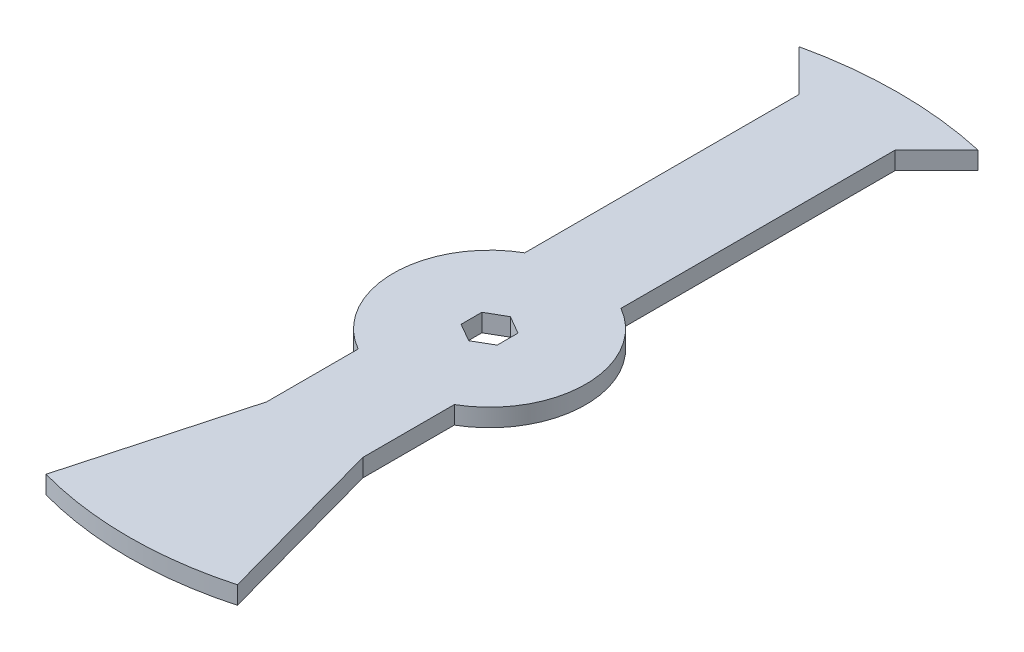
ISO-10303-21;
HEADER;
FILE_DESCRIPTION(('STEP AP214'),'2;1');
FILE_NAME('part.step','',(''),(''),'','','');
FILE_SCHEMA(('AUTOMOTIVE_DESIGN { 1 0 10303 214 1 1 1 1 }'));
ENDSEC;
DATA;
#1=APPLICATION_CONTEXT('core data for automotive mechanical design processes');
#2=APPLICATION_PROTOCOL_DEFINITION('international standard','automotive_design',2000,#1);
#3=PRODUCT_CONTEXT('',#1,'mechanical');
#4=PRODUCT('Part','Part','',(#3));
#5=PRODUCT_RELATED_PRODUCT_CATEGORY('part','',(#4));
#6=PRODUCT_DEFINITION_FORMATION('','',#4);
#7=PRODUCT_DEFINITION_CONTEXT('part definition',#1,'design');
#8=PRODUCT_DEFINITION('design','',#6,#7);
#9=PRODUCT_DEFINITION_SHAPE('','',#8);
#10=(LENGTH_UNIT() NAMED_UNIT(*) SI_UNIT(.MILLI.,.METRE.));
#11=(NAMED_UNIT(*) PLANE_ANGLE_UNIT() SI_UNIT($,.RADIAN.));
#12=(NAMED_UNIT(*) SI_UNIT($,.STERADIAN.) SOLID_ANGLE_UNIT());
#13=UNCERTAINTY_MEASURE_WITH_UNIT(LENGTH_MEASURE(1.E-05),#10,'distance_accuracy_value','');
#14=(GEOMETRIC_REPRESENTATION_CONTEXT(3) GLOBAL_UNCERTAINTY_ASSIGNED_CONTEXT((#13)) GLOBAL_UNIT_ASSIGNED_CONTEXT((#10,
#11,#12)) REPRESENTATION_CONTEXT('',''));
#15=CARTESIAN_POINT('',(0.,0.,0.));
#16=DIRECTION('',(0.,0.,1.));
#17=DIRECTION('',(1.,0.,0.));
#18=AXIS2_PLACEMENT_3D('',#15,#16,#17);
#19=CARTESIAN_POINT('',(-12.7,4.699,0.));
#20=DIRECTION('',(1.,0.,0.));
#21=DIRECTION('',(0.,0.,-1.));
#22=AXIS2_PLACEMENT_3D('',#19,#20,#21);
#23=PLANE('',#22);
#24=DIRECTION('',(0.,0.,1.));
#25=VECTOR('',#24,1.);
#26=CARTESIAN_POINT('',(-12.7,0.,0.));
#27=LINE('',#26,#25);
#28=CARTESIAN_POINT('',(-12.7,0.,21.9970452561247));
#29=VERTEX_POINT('',#28);
#30=CARTESIAN_POINT('',(-12.7,0.,46.1574010426348));
#31=VERTEX_POINT('',#30);
#32=EDGE_CURVE('E177',#29,#31,#27,.T.);
#33=ORIENTED_EDGE('',*,*,#32,.T.);
#34=DIRECTION('',(0.,-1.,0.));
#35=VECTOR('',#34,1.);
#36=CARTESIAN_POINT('',(-12.7,4.699,46.1574010426348));
#37=LINE('',#36,#35);
#38=CARTESIAN_POINT('',(-12.7,4.699,46.1574010426348));
#39=VERTEX_POINT('',#38);
#40=EDGE_CURVE('E12',#39,#31,#37,.T.);
#41=ORIENTED_EDGE('',*,*,#40,.F.);
#42=DIRECTION('',(0.,0.,1.));
#43=VECTOR('',#42,1.);
#44=CARTESIAN_POINT('',(-12.7,4.699,0.));
#45=LINE('',#44,#43);
#46=CARTESIAN_POINT('',(-12.7,4.699,21.9970452561247));
#47=VERTEX_POINT('',#46);
#48=EDGE_CURVE('E217',#47,#39,#45,.T.);
#49=ORIENTED_EDGE('',*,*,#48,.F.);
#50=DIRECTION('',(0.,-1.,0.));
#51=VECTOR('',#50,1.);
#52=CARTESIAN_POINT('',(-12.7,4.699,21.9970452561247));
#53=LINE('',#52,#51);
#54=EDGE_CURVE('E277',#47,#29,#53,.T.);
#55=ORIENTED_EDGE('',*,*,#54,.T.);
#56=EDGE_LOOP('',(#33,#41,#49,#55));
#57=FACE_BOUND('',#56,.T.);
#58=ADVANCED_FACE('F39',(#57),#23,.F.);
#59=CARTESIAN_POINT('',(0.,4.699,0.));
#60=DIRECTION('',(0.964169523899658,0.,0.265286880910283));
#61=DIRECTION('',(0.265286880910283,0.,-0.964169523899658));
#62=AXIS2_PLACEMENT_3D('',#59,#60,#61);
#63=PLANE('',#62);
#64=DIRECTION('',(-0.265286880910283,0.,0.964169523899658));
#65=VECTOR('',#64,1.);
#66=CARTESIAN_POINT('',(0.,0.,0.));
#67=LINE('',#66,#65);
#68=CARTESIAN_POINT('',(-25.2685754067045,0.,91.8371471514424));
#69=VERTEX_POINT('',#68);
#70=EDGE_CURVE('E280',#31,#69,#67,.T.);
#71=ORIENTED_EDGE('',*,*,#70,.T.);
#72=DIRECTION('',(0.,-1.,0.));
#73=VECTOR('',#72,1.);
#74=CARTESIAN_POINT('',(-25.2685754067045,4.699,91.8371471514424));
#75=LINE('',#74,#73);
#76=CARTESIAN_POINT('',(-25.2685754067045,4.699,91.8371471514424));
#77=VERTEX_POINT('',#76);
#78=EDGE_CURVE('E46',#77,#69,#75,.T.);
#79=ORIENTED_EDGE('',*,*,#78,.F.);
#80=DIRECTION('',(-0.265286880910283,0.,0.964169523899658));
#81=VECTOR('',#80,1.);
#82=CARTESIAN_POINT('',(0.,4.699,0.));
#83=LINE('',#82,#81);
#84=EDGE_CURVE('E222',#39,#77,#83,.T.);
#85=ORIENTED_EDGE('',*,*,#84,.F.);
#86=ORIENTED_EDGE('',*,*,#40,.T.);
#87=EDGE_LOOP('',(#71,#79,#85,#86));
#88=FACE_BOUND('',#87,.T.);
#89=ADVANCED_FACE('F384',(#88),#63,.F.);
#90=CARTESIAN_POINT('',(0.,4.699,0.));
#91=DIRECTION('',(0.,-1.,0.));
#92=DIRECTION('',(0.,0.,-1.));
#93=AXIS2_PLACEMENT_3D('',#90,#91,#92);
#94=CYLINDRICAL_SURFACE('',#93,95.25);
#95=CARTESIAN_POINT('',(0.,0.,0.));
#96=DIRECTION('',(0.,1.,0.));
#97=DIRECTION('',(0.,0.,1.));
#98=AXIS2_PLACEMENT_3D('',#95,#96,#97);
#99=CIRCLE('',#98,95.25);
#100=CARTESIAN_POINT('',(25.2685754067045,0.,91.8371471514425));
#101=VERTEX_POINT('',#100);
#102=EDGE_CURVE('E282',#69,#101,#99,.T.);
#103=ORIENTED_EDGE('',*,*,#102,.T.);
#104=DIRECTION('',(0.,-1.,0.));
#105=VECTOR('',#104,1.);
#106=CARTESIAN_POINT('',(25.2685754067045,4.699,91.8371471514425));
#107=LINE('',#106,#105);
#108=CARTESIAN_POINT('',(25.2685754067045,4.699,91.8371471514425));
#109=VERTEX_POINT('',#108);
#110=EDGE_CURVE('E327',#109,#101,#107,.T.);
#111=ORIENTED_EDGE('',*,*,#110,.F.);
#112=CARTESIAN_POINT('',(0.,4.699,0.));
#113=DIRECTION('',(0.,1.,0.));
#114=DIRECTION('',(0.,0.,1.));
#115=AXIS2_PLACEMENT_3D('',#112,#113,#114);
#116=CIRCLE('',#115,95.25);
#117=EDGE_CURVE('E234',#77,#109,#116,.T.);
#118=ORIENTED_EDGE('',*,*,#117,.F.);
#119=ORIENTED_EDGE('',*,*,#78,.T.);
#120=EDGE_LOOP('',(#103,#111,#118,#119));
#121=FACE_BOUND('',#120,.T.);
#122=ADVANCED_FACE('F334',(#121),#94,.T.);
#123=CARTESIAN_POINT('',(0.,4.699,0.));
#124=DIRECTION('',(-0.964169523899658,0.,0.265286880910284));
#125=DIRECTION('',(0.265286880910284,0.,0.964169523899658));
#126=AXIS2_PLACEMENT_3D('',#123,#124,#125);
#127=PLANE('',#126);
#128=DIRECTION('',(-0.265286880910284,0.,-0.964169523899658));
#129=VECTOR('',#128,1.);
#130=CARTESIAN_POINT('',(0.,0.,0.));
#131=LINE('',#130,#129);
#132=CARTESIAN_POINT('',(12.7,0.,46.1574010426348));
#133=VERTEX_POINT('',#132);
#134=EDGE_CURVE('E284',#101,#133,#131,.T.);
#135=ORIENTED_EDGE('',*,*,#134,.T.);
#136=DIRECTION('',(0.,-1.,0.));
#137=VECTOR('',#136,1.);
#138=CARTESIAN_POINT('',(12.7,4.699,46.1574010426348));
#139=LINE('',#138,#137);
#140=CARTESIAN_POINT('',(12.7,4.699,46.1574010426348));
#141=VERTEX_POINT('',#140);
#142=EDGE_CURVE('E325',#141,#133,#139,.T.);
#143=ORIENTED_EDGE('',*,*,#142,.F.);
#144=DIRECTION('',(-0.265286880910284,0.,-0.964169523899658));
#145=VECTOR('',#144,1.);
#146=CARTESIAN_POINT('',(0.,4.699,0.));
#147=LINE('',#146,#145);
#148=EDGE_CURVE('E237',#109,#141,#147,.T.);
#149=ORIENTED_EDGE('',*,*,#148,.F.);
#150=ORIENTED_EDGE('',*,*,#110,.T.);
#151=EDGE_LOOP('',(#135,#143,#149,#150));
#152=FACE_BOUND('',#151,.T.);
#153=ADVANCED_FACE('F342',(#152),#127,.F.);
#154=CARTESIAN_POINT('',(12.7,4.699,0.));
#155=DIRECTION('',(1.,0.,0.));
#156=DIRECTION('',(0.,0.,-1.));
#157=AXIS2_PLACEMENT_3D('',#154,#155,#156);
#158=PLANE('',#157);
#159=DIRECTION('',(0.,0.,1.));
#160=VECTOR('',#159,1.);
#161=CARTESIAN_POINT('',(12.7,0.,0.));
#162=LINE('',#161,#160);
#163=CARTESIAN_POINT('',(12.7,0.,21.9970452561247));
#164=VERTEX_POINT('',#163);
#165=EDGE_CURVE('E287',#164,#133,#162,.T.);
#166=ORIENTED_EDGE('',*,*,#165,.F.);
#167=DIRECTION('',(0.,-1.,0.));
#168=VECTOR('',#167,1.);
#169=CARTESIAN_POINT('',(12.7,4.699,21.9970452561247));
#170=LINE('',#169,#168);
#171=CARTESIAN_POINT('',(12.7,4.699,21.9970452561247));
#172=VERTEX_POINT('',#171);
#173=EDGE_CURVE('E323',#172,#164,#170,.T.);
#174=ORIENTED_EDGE('',*,*,#173,.F.);
#175=DIRECTION('',(0.,0.,1.));
#176=VECTOR('',#175,1.);
#177=CARTESIAN_POINT('',(12.7,4.699,0.));
#178=LINE('',#177,#176);
#179=EDGE_CURVE('E241',#172,#141,#178,.T.);
#180=ORIENTED_EDGE('',*,*,#179,.T.);
#181=ORIENTED_EDGE('',*,*,#142,.T.);
#182=EDGE_LOOP('',(#166,#174,#180,#181));
#183=FACE_BOUND('',#182,.T.);
#184=ADVANCED_FACE('F394',(#183),#158,.T.);
#185=CARTESIAN_POINT('',(0.,4.699,0.));
#186=DIRECTION('',(0.,-1.,0.));
#187=DIRECTION('',(0.,0.,-1.));
#188=AXIS2_PLACEMENT_3D('',#185,#186,#187);
#189=CYLINDRICAL_SURFACE('',#188,25.4);
#190=CARTESIAN_POINT('',(0.,0.,0.));
#191=DIRECTION('',(0.,1.,0.));
#192=DIRECTION('',(0.,0.,1.));
#193=AXIS2_PLACEMENT_3D('',#190,#191,#192);
#194=CIRCLE('',#193,25.4);
#195=CARTESIAN_POINT('',(12.7,0.,-21.9970452561247));
#196=VERTEX_POINT('',#195);
#197=EDGE_CURVE('E290',#196,#164,#194,.F.);
#198=ORIENTED_EDGE('',*,*,#197,.F.);
#199=DIRECTION('',(0.,-1.,0.));
#200=VECTOR('',#199,1.);
#201=CARTESIAN_POINT('',(12.7,4.699,-21.9970452561247));
#202=LINE('',#201,#200);
#203=CARTESIAN_POINT('',(12.7,4.699,-21.9970452561247));
#204=VERTEX_POINT('',#203);
#205=EDGE_CURVE('E321',#204,#196,#202,.T.);
#206=ORIENTED_EDGE('',*,*,#205,.F.);
#207=CARTESIAN_POINT('',(0.,4.699,0.));
#208=DIRECTION('',(0.,1.,0.));
#209=DIRECTION('',(0.,0.,1.));
#210=AXIS2_PLACEMENT_3D('',#207,#208,#209);
#211=CIRCLE('',#210,25.4);
#212=EDGE_CURVE('E246',#204,#172,#211,.F.);
#213=ORIENTED_EDGE('',*,*,#212,.T.);
#214=ORIENTED_EDGE('',*,*,#173,.T.);
#215=EDGE_LOOP('',(#198,#206,#213,#214));
#216=FACE_BOUND('',#215,.T.);
#217=ADVANCED_FACE('F356',(#216),#189,.T.);
#218=CARTESIAN_POINT('',(12.7,4.699,0.));
#219=DIRECTION('',(1.,0.,0.));
#220=DIRECTION('',(0.,0.,-1.));
#221=AXIS2_PLACEMENT_3D('',#218,#219,#220);
#222=PLANE('',#221);
#223=DIRECTION('',(0.,0.,1.));
#224=VECTOR('',#223,1.);
#225=CARTESIAN_POINT('',(12.7,0.,0.));
#226=LINE('',#225,#224);
#227=CARTESIAN_POINT('',(12.7,0.,-94.3995365454725));
#228=VERTEX_POINT('',#227);
#229=EDGE_CURVE('E293',#228,#196,#226,.T.);
#230=ORIENTED_EDGE('',*,*,#229,.F.);
#231=DIRECTION('',(0.,-1.,0.));
#232=VECTOR('',#231,1.);
#233=CARTESIAN_POINT('',(12.7,4.699,-94.3995365454725));
#234=LINE('',#233,#232);
#235=CARTESIAN_POINT('',(12.7,4.699,-94.3995365454725));
#236=VERTEX_POINT('',#235);
#237=EDGE_CURVE('E319',#236,#228,#234,.T.);
#238=ORIENTED_EDGE('',*,*,#237,.F.);
#239=DIRECTION('',(0.,0.,1.));
#240=VECTOR('',#239,1.);
#241=CARTESIAN_POINT('',(12.7,4.699,0.));
#242=LINE('',#241,#240);
#243=EDGE_CURVE('E252',#236,#204,#242,.T.);
#244=ORIENTED_EDGE('',*,*,#243,.T.);
#245=ORIENTED_EDGE('',*,*,#205,.T.);
#246=EDGE_LOOP('',(#230,#238,#244,#245));
#247=FACE_BOUND('',#246,.T.);
#248=ADVANCED_FACE('F361',(#247),#222,.T.);
#249=CARTESIAN_POINT('',(-40.8497682727362,4.699,-40.8497682727361));
#250=DIRECTION('',(0.707106781186548,0.,0.707106781186547));
#251=DIRECTION('',(0.707106781186547,0.,-0.707106781186548));
#252=AXIS2_PLACEMENT_3D('',#249,#250,#251);
#253=PLANE('',#252);
#254=DIRECTION('',(-0.707106781186547,0.,0.707106781186548));
#255=VECTOR('',#254,1.);
#256=CARTESIAN_POINT('',(-40.8497682727362,0.,-40.8497682727361));
#257=LINE('',#256,#255);
#258=CARTESIAN_POINT('',(23.6319941261292,0.,-105.331530671602));
#259=VERTEX_POINT('',#258);
#260=EDGE_CURVE('E296',#259,#228,#257,.T.);
#261=ORIENTED_EDGE('',*,*,#260,.F.);
#262=DIRECTION('',(0.,-1.,0.));
#263=VECTOR('',#262,1.);
#264=CARTESIAN_POINT('',(23.6319941261292,4.699,-105.331530671602));
#265=LINE('',#264,#263);
#266=CARTESIAN_POINT('',(23.6319941261292,4.699,-105.331530671602));
#267=VERTEX_POINT('',#266);
#268=EDGE_CURVE('E317',#267,#259,#265,.T.);
#269=ORIENTED_EDGE('',*,*,#268,.F.);
#270=DIRECTION('',(-0.707106781186547,0.,0.707106781186548));
#271=VECTOR('',#270,1.);
#272=CARTESIAN_POINT('',(-40.8497682727362,4.699,-40.8497682727361));
#273=LINE('',#272,#271);
#274=EDGE_CURVE('E256',#267,#236,#273,.T.);
#275=ORIENTED_EDGE('',*,*,#274,.T.);
#276=ORIENTED_EDGE('',*,*,#237,.T.);
#277=EDGE_LOOP('',(#261,#269,#275,#276));
#278=FACE_BOUND('',#277,.T.);
#279=ADVANCED_FACE('F364',(#278),#253,.T.);
#280=CARTESIAN_POINT('',(0.,4.699,0.));
#281=DIRECTION('',(0.,-1.,0.));
#282=DIRECTION('',(0.,0.,-1.));
#283=AXIS2_PLACEMENT_3D('',#280,#281,#282);
#284=CYLINDRICAL_SURFACE('',#283,107.95);
#285=CARTESIAN_POINT('',(0.,0.,0.));
#286=DIRECTION('',(0.,1.,0.));
#287=DIRECTION('',(0.,0.,1.));
#288=AXIS2_PLACEMENT_3D('',#285,#286,#287);
#289=CIRCLE('',#288,107.95);
#290=CARTESIAN_POINT('',(-23.6319941261293,0.,-105.331530671602));
#291=VERTEX_POINT('',#290);
#292=EDGE_CURVE('E299',#291,#259,#289,.F.);
#293=ORIENTED_EDGE('',*,*,#292,.F.);
#294=DIRECTION('',(0.,-1.,0.));
#295=VECTOR('',#294,1.);
#296=CARTESIAN_POINT('',(-23.6319941261293,4.699,-105.331530671602));
#297=LINE('',#296,#295);
#298=CARTESIAN_POINT('',(-23.6319941261293,4.699,-105.331530671602));
#299=VERTEX_POINT('',#298);
#300=EDGE_CURVE('E315',#299,#291,#297,.T.);
#301=ORIENTED_EDGE('',*,*,#300,.F.);
#302=CARTESIAN_POINT('',(0.,4.699,0.));
#303=DIRECTION('',(0.,1.,0.));
#304=DIRECTION('',(0.,0.,1.));
#305=AXIS2_PLACEMENT_3D('',#302,#303,#304);
#306=CIRCLE('',#305,107.95);
#307=EDGE_CURVE('E261',#299,#267,#306,.F.);
#308=ORIENTED_EDGE('',*,*,#307,.T.);
#309=ORIENTED_EDGE('',*,*,#268,.T.);
#310=EDGE_LOOP('',(#293,#301,#308,#309));
#311=FACE_BOUND('',#310,.T.);
#312=ADVANCED_FACE('F369',(#311),#284,.T.);
#313=CARTESIAN_POINT('',(40.8497682727362,4.699,-40.8497682727361));
#314=DIRECTION('',(-0.707106781186548,0.,0.707106781186547));
#315=DIRECTION('',(0.707106781186547,0.,0.707106781186548));
#316=AXIS2_PLACEMENT_3D('',#313,#314,#315);
#317=PLANE('',#316);
#318=DIRECTION('',(-0.707106781186547,0.,-0.707106781186548));
#319=VECTOR('',#318,1.);
#320=CARTESIAN_POINT('',(40.8497682727362,0.,-40.8497682727361));
#321=LINE('',#320,#319);
#322=CARTESIAN_POINT('',(-12.7,0.,-94.3995365454725));
#323=VERTEX_POINT('',#322);
#324=EDGE_CURVE('E302',#323,#291,#321,.T.);
#325=ORIENTED_EDGE('',*,*,#324,.F.);
#326=DIRECTION('',(0.,-1.,0.));
#327=VECTOR('',#326,1.);
#328=CARTESIAN_POINT('',(-12.7,4.699,-94.3995365454725));
#329=LINE('',#328,#327);
#330=CARTESIAN_POINT('',(-12.7,4.699,-94.3995365454725));
#331=VERTEX_POINT('',#330);
#332=EDGE_CURVE('E313',#331,#323,#329,.T.);
#333=ORIENTED_EDGE('',*,*,#332,.F.);
#334=DIRECTION('',(-0.707106781186547,0.,-0.707106781186548));
#335=VECTOR('',#334,1.);
#336=CARTESIAN_POINT('',(40.8497682727362,4.699,-40.8497682727361));
#337=LINE('',#336,#335);
#338=EDGE_CURVE('E265',#331,#299,#337,.T.);
#339=ORIENTED_EDGE('',*,*,#338,.T.);
#340=ORIENTED_EDGE('',*,*,#300,.T.);
#341=EDGE_LOOP('',(#325,#333,#339,#340));
#342=FACE_BOUND('',#341,.T.);
#343=ADVANCED_FACE('F372',(#342),#317,.T.);
#344=CARTESIAN_POINT('',(-12.7,4.699,0.));
#345=DIRECTION('',(1.,0.,0.));
#346=DIRECTION('',(0.,0.,-1.));
#347=AXIS2_PLACEMENT_3D('',#344,#345,#346);
#348=PLANE('',#347);
#349=DIRECTION('',(0.,0.,1.));
#350=VECTOR('',#349,1.);
#351=CARTESIAN_POINT('',(-12.7,0.,0.));
#352=LINE('',#351,#350);
#353=CARTESIAN_POINT('',(-12.7,0.,-21.9970452561247));
#354=VERTEX_POINT('',#353);
#355=EDGE_CURVE('E305',#323,#354,#352,.T.);
#356=ORIENTED_EDGE('',*,*,#355,.T.);
#357=DIRECTION('',(0.,-1.,0.));
#358=VECTOR('',#357,1.);
#359=CARTESIAN_POINT('',(-12.7,4.699,-21.9970452561247));
#360=LINE('',#359,#358);
#361=CARTESIAN_POINT('',(-12.7,4.699,-21.9970452561247));
#362=VERTEX_POINT('',#361);
#363=EDGE_CURVE('E310',#362,#354,#360,.T.);
#364=ORIENTED_EDGE('',*,*,#363,.F.);
#365=DIRECTION('',(0.,0.,1.));
#366=VECTOR('',#365,1.);
#367=CARTESIAN_POINT('',(-12.7,4.699,0.));
#368=LINE('',#367,#366);
#369=EDGE_CURVE('E270',#331,#362,#368,.T.);
#370=ORIENTED_EDGE('',*,*,#369,.F.);
#371=ORIENTED_EDGE('',*,*,#332,.T.);
#372=EDGE_LOOP('',(#356,#364,#370,#371));
#373=FACE_BOUND('',#372,.T.);
#374=ADVANCED_FACE('F378',(#373),#348,.F.);
#375=CARTESIAN_POINT('',(0.,4.699,0.));
#376=DIRECTION('',(0.,-1.,0.));
#377=DIRECTION('',(0.,0.,-1.));
#378=AXIS2_PLACEMENT_3D('',#375,#376,#377);
#379=CYLINDRICAL_SURFACE('',#378,25.4);
#380=CARTESIAN_POINT('',(0.,0.,0.));
#381=DIRECTION('',(0.,1.,0.));
#382=DIRECTION('',(0.,0.,1.));
#383=AXIS2_PLACEMENT_3D('',#380,#381,#382);
#384=CIRCLE('',#383,25.4);
#385=EDGE_CURVE('E223',#354,#29,#384,.T.);
#386=ORIENTED_EDGE('',*,*,#385,.T.);
#387=ORIENTED_EDGE('',*,*,#54,.F.);
#388=CARTESIAN_POINT('',(0.,4.699,0.));
#389=DIRECTION('',(0.,1.,0.));
#390=DIRECTION('',(0.,0.,1.));
#391=AXIS2_PLACEMENT_3D('',#388,#389,#390);
#392=CIRCLE('',#391,25.4);
#393=EDGE_CURVE('E273',#362,#47,#392,.T.);
#394=ORIENTED_EDGE('',*,*,#393,.F.);
#395=ORIENTED_EDGE('',*,*,#363,.T.);
#396=EDGE_LOOP('',(#386,#387,#394,#395));
#397=FACE_BOUND('',#396,.T.);
#398=ADVANCED_FACE('F382',(#397),#379,.T.);
#399=CARTESIAN_POINT('',(0.,4.699,0.));
#400=DIRECTION('',(0.,1.,0.));
#401=DIRECTION('',(0.,0.,1.));
#402=AXIS2_PLACEMENT_3D('',#399,#400,#401);
#403=PLANE('',#402);
#404=DIRECTION('',(-0.866025403784438,0.,0.5));
#405=VECTOR('',#404,1.);
#406=CARTESIAN_POINT('',(0.,4.699,-5.49926131403118));
#407=LINE('',#406,#405);
#408=CARTESIAN_POINT('',(0.,4.699,-5.49926131403118));
#409=VERTEX_POINT('',#408);
#410=CARTESIAN_POINT('',(-4.7625,4.699,-2.74963065701559));
#411=VERTEX_POINT('',#410);
#412=EDGE_CURVE('E53',#409,#411,#407,.T.);
#413=ORIENTED_EDGE('',*,*,#412,.F.);
#414=DIRECTION('',(-0.866025403784439,0.,-0.5));
#415=VECTOR('',#414,1.);
#416=CARTESIAN_POINT('',(4.7625,4.699,-2.74963065701559));
#417=LINE('',#416,#415);
#418=CARTESIAN_POINT('',(4.7625,4.699,-2.74963065701559));
#419=VERTEX_POINT('',#418);
#420=EDGE_CURVE('E171',#419,#409,#417,.T.);
#421=ORIENTED_EDGE('',*,*,#420,.F.);
#422=DIRECTION('',(0.,0.,-1.));
#423=VECTOR('',#422,1.);
#424=CARTESIAN_POINT('',(4.7625,4.699,2.74963065701559));
#425=LINE('',#424,#423);
#426=CARTESIAN_POINT('',(4.7625,4.699,2.74963065701559));
#427=VERTEX_POINT('',#426);
#428=EDGE_CURVE('E206',#427,#419,#425,.T.);
#429=ORIENTED_EDGE('',*,*,#428,.F.);
#430=DIRECTION('',(0.866025403784438,0.,-0.5));
#431=VECTOR('',#430,1.);
#432=CARTESIAN_POINT('',(0.,4.699,5.49926131403119));
#433=LINE('',#432,#431);
#434=CARTESIAN_POINT('',(0.,4.699,5.49926131403119));
#435=VERTEX_POINT('',#434);
#436=EDGE_CURVE('E447',#435,#427,#433,.T.);
#437=ORIENTED_EDGE('',*,*,#436,.F.);
#438=DIRECTION('',(0.866025403784439,0.,0.5));
#439=VECTOR('',#438,1.);
#440=CARTESIAN_POINT('',(-4.7625,4.699,2.74963065701559));
#441=LINE('',#440,#439);
#442=CARTESIAN_POINT('',(-4.7625,4.699,2.74963065701559));
#443=VERTEX_POINT('',#442);
#444=EDGE_CURVE('E452',#443,#435,#441,.T.);
#445=ORIENTED_EDGE('',*,*,#444,.F.);
#446=DIRECTION('',(0.,0.,1.));
#447=VECTOR('',#446,1.);
#448=CARTESIAN_POINT('',(-4.7625,4.699,-2.74963065701559));
#449=LINE('',#448,#447);
#450=EDGE_CURVE('E187',#411,#443,#449,.T.);
#451=ORIENTED_EDGE('',*,*,#450,.F.);
#452=EDGE_LOOP('',(#413,#421,#429,#437,#445,#451));
#453=FACE_BOUND('',#452,.T.);
#454=ORIENTED_EDGE('',*,*,#48,.T.);
#455=ORIENTED_EDGE('',*,*,#84,.T.);
#456=ORIENTED_EDGE('',*,*,#117,.T.);
#457=ORIENTED_EDGE('',*,*,#148,.T.);
#458=ORIENTED_EDGE('',*,*,#179,.F.);
#459=ORIENTED_EDGE('',*,*,#212,.F.);
#460=ORIENTED_EDGE('',*,*,#243,.F.);
#461=ORIENTED_EDGE('',*,*,#274,.F.);
#462=ORIENTED_EDGE('',*,*,#307,.F.);
#463=ORIENTED_EDGE('',*,*,#338,.F.);
#464=ORIENTED_EDGE('',*,*,#369,.T.);
#465=ORIENTED_EDGE('',*,*,#393,.T.);
#466=EDGE_LOOP('',(#454,#455,#456,#457,#458,#459,#460,#461,#462,#463,#464,#465));
#467=FACE_BOUND('',#466,.T.);
#468=ADVANCED_FACE('F346',(#453,#467),#403,.T.);
#469=CARTESIAN_POINT('',(0.,0.,0.));
#470=DIRECTION('',(0.,1.,0.));
#471=DIRECTION('',(0.,0.,1.));
#472=AXIS2_PLACEMENT_3D('',#469,#470,#471);
#473=PLANE('',#472);
#474=DIRECTION('',(0.866025403784439,0.,0.5));
#475=VECTOR('',#474,1.);
#476=CARTESIAN_POINT('',(4.7625,0.,-2.74963065701559));
#477=LINE('',#476,#475);
#478=CARTESIAN_POINT('',(0.,0.,-5.49926131403118));
#479=VERTEX_POINT('',#478);
#480=CARTESIAN_POINT('',(4.7625,0.,-2.74963065701559));
#481=VERTEX_POINT('',#480);
#482=EDGE_CURVE('E184',#479,#481,#477,.T.);
#483=ORIENTED_EDGE('',*,*,#482,.F.);
#484=DIRECTION('',(0.866025403784439,0.,-0.5));
#485=VECTOR('',#484,1.);
#486=CARTESIAN_POINT('',(0.,0.,-5.49926131403118));
#487=LINE('',#486,#485);
#488=CARTESIAN_POINT('',(-4.7625,0.,-2.74963065701559));
#489=VERTEX_POINT('',#488);
#490=EDGE_CURVE('E165',#489,#479,#487,.T.);
#491=ORIENTED_EDGE('',*,*,#490,.F.);
#492=DIRECTION('',(0.,0.,-1.));
#493=VECTOR('',#492,1.);
#494=CARTESIAN_POINT('',(-4.7625,0.,-2.74963065701559));
#495=LINE('',#494,#493);
#496=CARTESIAN_POINT('',(-4.7625,0.,2.74963065701559));
#497=VERTEX_POINT('',#496);
#498=EDGE_CURVE('E174',#497,#489,#495,.T.);
#499=ORIENTED_EDGE('',*,*,#498,.F.);
#500=DIRECTION('',(-0.866025403784439,0.,-0.5));
#501=VECTOR('',#500,1.);
#502=CARTESIAN_POINT('',(-4.7625,0.,2.74963065701559));
#503=LINE('',#502,#501);
#504=CARTESIAN_POINT('',(0.,0.,5.49926131403119));
#505=VERTEX_POINT('',#504);
#506=EDGE_CURVE('E61',#505,#497,#503,.T.);
#507=ORIENTED_EDGE('',*,*,#506,.F.);
#508=DIRECTION('',(-0.866025403784438,0.,0.5));
#509=VECTOR('',#508,1.);
#510=CARTESIAN_POINT('',(0.,0.,5.49926131403119));
#511=LINE('',#510,#509);
#512=CARTESIAN_POINT('',(4.7625,0.,2.74963065701559));
#513=VERTEX_POINT('',#512);
#514=EDGE_CURVE('E441',#513,#505,#511,.T.);
#515=ORIENTED_EDGE('',*,*,#514,.F.);
#516=DIRECTION('',(0.,0.,1.));
#517=VECTOR('',#516,1.);
#518=CARTESIAN_POINT('',(4.7625,0.,2.74963065701559));
#519=LINE('',#518,#517);
#520=EDGE_CURVE('E189',#481,#513,#519,.T.);
#521=ORIENTED_EDGE('',*,*,#520,.F.);
#522=EDGE_LOOP('',(#483,#491,#499,#507,#515,#521));
#523=FACE_BOUND('',#522,.T.);
#524=ORIENTED_EDGE('',*,*,#32,.F.);
#525=ORIENTED_EDGE('',*,*,#385,.F.);
#526=ORIENTED_EDGE('',*,*,#355,.F.);
#527=ORIENTED_EDGE('',*,*,#324,.T.);
#528=ORIENTED_EDGE('',*,*,#292,.T.);
#529=ORIENTED_EDGE('',*,*,#260,.T.);
#530=ORIENTED_EDGE('',*,*,#229,.T.);
#531=ORIENTED_EDGE('',*,*,#197,.T.);
#532=ORIENTED_EDGE('',*,*,#165,.T.);
#533=ORIENTED_EDGE('',*,*,#134,.F.);
#534=ORIENTED_EDGE('',*,*,#102,.F.);
#535=ORIENTED_EDGE('',*,*,#70,.F.);
#536=EDGE_LOOP('',(#524,#525,#526,#527,#528,#529,#530,#531,#532,#533,#534,#535));
#537=FACE_BOUND('',#536,.T.);
#538=ADVANCED_FACE('F180',(#523,#537),#473,.F.);
#539=CARTESIAN_POINT('',(0.,-0.00100000000000013,-5.49926131403118));
#540=DIRECTION('',(-0.5,0.,-0.866025403784439));
#541=DIRECTION('',(-0.866025403784439,0.,0.5));
#542=AXIS2_PLACEMENT_3D('',#539,#540,#541);
#543=PLANE('',#542);
#544=ORIENTED_EDGE('',*,*,#490,.T.);
#545=DIRECTION('',(0.,1.,0.));
#546=VECTOR('',#545,1.);
#547=CARTESIAN_POINT('',(0.,-0.00100000000000013,-5.49926131403118));
#548=LINE('',#547,#546);
#549=EDGE_CURVE('E178',#479,#409,#548,.T.);
#550=ORIENTED_EDGE('',*,*,#549,.T.);
#551=ORIENTED_EDGE('',*,*,#412,.T.);
#552=DIRECTION('',(0.,1.,0.));
#553=VECTOR('',#552,1.);
#554=CARTESIAN_POINT('',(-4.7625,-0.00100000000000013,-2.74963065701559));
#555=LINE('',#554,#553);
#556=EDGE_CURVE('E161',#489,#411,#555,.T.);
#557=ORIENTED_EDGE('',*,*,#556,.F.);
#558=EDGE_LOOP('',(#544,#550,#551,#557));
#559=FACE_BOUND('',#558,.T.);
#560=ADVANCED_FACE('F163',(#559),#543,.F.);
#561=CARTESIAN_POINT('',(4.7625,-0.00100000000000013,-2.74963065701559));
#562=DIRECTION('',(0.5,0.,-0.866025403784439));
#563=DIRECTION('',(-0.866025403784439,0.,-0.5));
#564=AXIS2_PLACEMENT_3D('',#561,#562,#563);
#565=PLANE('',#564);
#566=ORIENTED_EDGE('',*,*,#482,.T.);
#567=DIRECTION('',(0.,1.,0.));
#568=VECTOR('',#567,1.);
#569=CARTESIAN_POINT('',(4.7625,-0.00100000000000013,-2.74963065701559));
#570=LINE('',#569,#568);
#571=EDGE_CURVE('E210',#481,#419,#570,.T.);
#572=ORIENTED_EDGE('',*,*,#571,.T.);
#573=ORIENTED_EDGE('',*,*,#420,.T.);
#574=ORIENTED_EDGE('',*,*,#549,.F.);
#575=EDGE_LOOP('',(#566,#572,#573,#574));
#576=FACE_BOUND('',#575,.T.);
#577=ADVANCED_FACE('F419',(#576),#565,.F.);
#578=CARTESIAN_POINT('',(4.7625,-0.00100000000000013,2.74963065701559));
#579=DIRECTION('',(1.,0.,0.));
#580=DIRECTION('',(0.,0.,-1.));
#581=AXIS2_PLACEMENT_3D('',#578,#579,#580);
#582=PLANE('',#581);
#583=ORIENTED_EDGE('',*,*,#520,.T.);
#584=DIRECTION('',(0.,1.,0.));
#585=VECTOR('',#584,1.);
#586=CARTESIAN_POINT('',(4.7625,-0.00100000000000013,2.74963065701559));
#587=LINE('',#586,#585);
#588=EDGE_CURVE('E212',#513,#427,#587,.T.);
#589=ORIENTED_EDGE('',*,*,#588,.T.);
#590=ORIENTED_EDGE('',*,*,#428,.T.);
#591=ORIENTED_EDGE('',*,*,#571,.F.);
#592=EDGE_LOOP('',(#583,#589,#590,#591));
#593=FACE_BOUND('',#592,.T.);
#594=ADVANCED_FACE('F428',(#593),#582,.F.);
#595=CARTESIAN_POINT('',(0.,-0.00100000000000013,5.49926131403119));
#596=DIRECTION('',(0.5,0.,0.866025403784438));
#597=DIRECTION('',(0.866025403784438,0.,-0.5));
#598=AXIS2_PLACEMENT_3D('',#595,#596,#597);
#599=PLANE('',#598);
#600=ORIENTED_EDGE('',*,*,#514,.T.);
#601=DIRECTION('',(0.,1.,0.));
#602=VECTOR('',#601,1.);
#603=CARTESIAN_POINT('',(0.,-0.00100000000000013,5.49926131403119));
#604=LINE('',#603,#602);
#605=EDGE_CURVE('E214',#505,#435,#604,.T.);
#606=ORIENTED_EDGE('',*,*,#605,.T.);
#607=ORIENTED_EDGE('',*,*,#436,.T.);
#608=ORIENTED_EDGE('',*,*,#588,.F.);
#609=EDGE_LOOP('',(#600,#606,#607,#608));
#610=FACE_BOUND('',#609,.T.);
#611=ADVANCED_FACE('F425',(#610),#599,.F.);
#612=CARTESIAN_POINT('',(-4.7625,-0.00100000000000013,2.74963065701559));
#613=DIRECTION('',(-0.5,0.,0.866025403784439));
#614=DIRECTION('',(0.866025403784439,0.,0.5));
#615=AXIS2_PLACEMENT_3D('',#612,#613,#614);
#616=PLANE('',#615);
#617=ORIENTED_EDGE('',*,*,#506,.T.);
#618=DIRECTION('',(0.,1.,0.));
#619=VECTOR('',#618,1.);
#620=CARTESIAN_POINT('',(-4.7625,-0.00100000000000013,2.74963065701559));
#621=LINE('',#620,#619);
#622=EDGE_CURVE('E170',#497,#443,#621,.T.);
#623=ORIENTED_EDGE('',*,*,#622,.T.);
#624=ORIENTED_EDGE('',*,*,#444,.T.);
#625=ORIENTED_EDGE('',*,*,#605,.F.);
#626=EDGE_LOOP('',(#617,#623,#624,#625));
#627=FACE_BOUND('',#626,.T.);
#628=ADVANCED_FACE('F422',(#627),#616,.F.);
#629=CARTESIAN_POINT('',(-4.7625,-0.00100000000000013,-2.74963065701559));
#630=DIRECTION('',(-1.,0.,0.));
#631=DIRECTION('',(0.,0.,1.));
#632=AXIS2_PLACEMENT_3D('',#629,#630,#631);
#633=PLANE('',#632);
#634=ORIENTED_EDGE('',*,*,#498,.T.);
#635=ORIENTED_EDGE('',*,*,#556,.T.);
#636=ORIENTED_EDGE('',*,*,#450,.T.);
#637=ORIENTED_EDGE('',*,*,#622,.F.);
#638=EDGE_LOOP('',(#634,#635,#636,#637));
#639=FACE_BOUND('',#638,.T.);
#640=ADVANCED_FACE('F175',(#639),#633,.F.);
#641=CLOSED_SHELL('',(#58,#89,#122,#153,#184,#217,#248,#279,#312,#343,#374,#398,#468,#538,#560,
#577,#594,#611,#628,#640));
#642=MANIFOLD_SOLID_BREP('B2',#641);
#643=ADVANCED_BREP_SHAPE_REPRESENTATION('',(#18,#642),#14);
#644=SHAPE_DEFINITION_REPRESENTATION(#9,#643);
ENDSEC;
END-ISO-10303-21;
